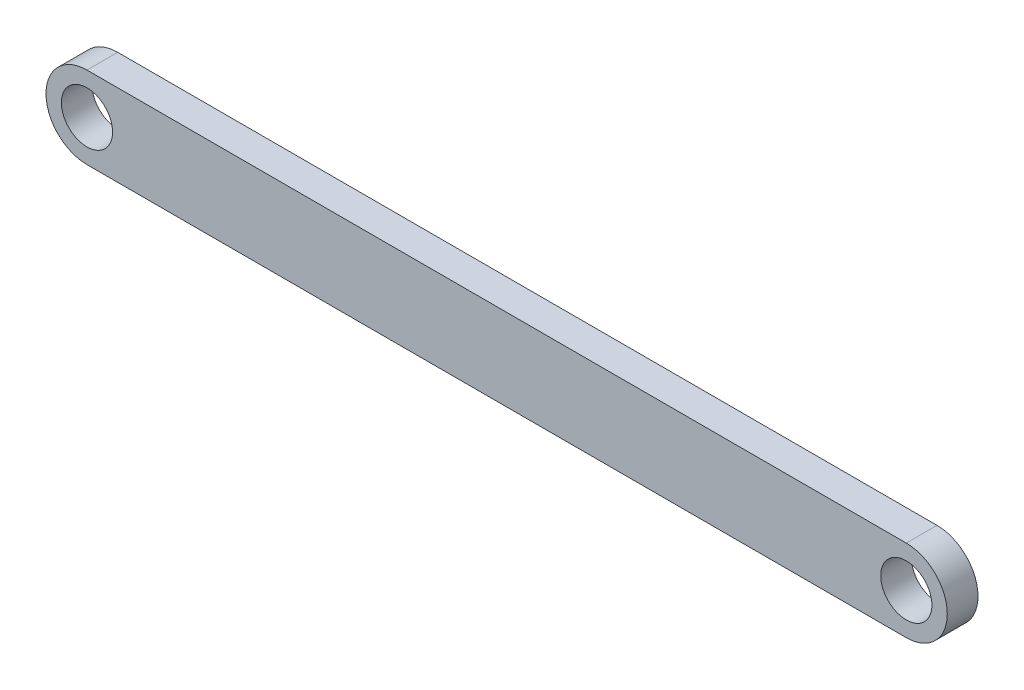
ISO-10303-21;
HEADER;
FILE_DESCRIPTION(('STEP AP214'),'2;1');
FILE_NAME('part.step','',(''),(''),'','','');
FILE_SCHEMA(('AUTOMOTIVE_DESIGN { 1 0 10303 214 1 1 1 1 }'));
ENDSEC;
DATA;
#1=APPLICATION_CONTEXT('core data for automotive mechanical design processes');
#2=APPLICATION_PROTOCOL_DEFINITION('international standard','automotive_design',2000,#1);
#3=PRODUCT_CONTEXT('',#1,'mechanical');
#4=PRODUCT('Part','Part','',(#3));
#5=PRODUCT_RELATED_PRODUCT_CATEGORY('part','',(#4));
#6=PRODUCT_DEFINITION_FORMATION('','',#4);
#7=PRODUCT_DEFINITION_CONTEXT('part definition',#1,'design');
#8=PRODUCT_DEFINITION('design','',#6,#7);
#9=PRODUCT_DEFINITION_SHAPE('','',#8);
#10=(LENGTH_UNIT() NAMED_UNIT(*) SI_UNIT(.MILLI.,.METRE.));
#11=(NAMED_UNIT(*) PLANE_ANGLE_UNIT() SI_UNIT($,.RADIAN.));
#12=(NAMED_UNIT(*) SI_UNIT($,.STERADIAN.) SOLID_ANGLE_UNIT());
#13=UNCERTAINTY_MEASURE_WITH_UNIT(LENGTH_MEASURE(1.E-05),#10,'distance_accuracy_value','');
#14=(GEOMETRIC_REPRESENTATION_CONTEXT(3) GLOBAL_UNCERTAINTY_ASSIGNED_CONTEXT((#13)) GLOBAL_UNIT_ASSIGNED_CONTEXT((#10,
#11,#12)) REPRESENTATION_CONTEXT('',''));
#15=CARTESIAN_POINT('',(0.,0.,0.));
#16=DIRECTION('',(0.,0.,1.));
#17=DIRECTION('',(1.,0.,0.));
#18=AXIS2_PLACEMENT_3D('',#15,#16,#17);
#19=CARTESIAN_POINT('',(-40.,4.00000000000001,3.));
#20=DIRECTION('',(0.,1.,0.));
#21=DIRECTION('',(-1.,0.,0.));
#22=AXIS2_PLACEMENT_3D('',#19,#20,#21);
#23=PLANE('',#22);
#24=DIRECTION('',(1.,0.,0.));
#25=VECTOR('',#24,1.);
#26=CARTESIAN_POINT('',(-40.,4.00000000000001,0.));
#27=LINE('',#26,#25);
#28=CARTESIAN_POINT('',(-40.,4.00000000000001,0.));
#29=VERTEX_POINT('',#28);
#30=CARTESIAN_POINT('',(40.,4.,0.));
#31=VERTEX_POINT('',#30);
#32=EDGE_CURVE('E136',#29,#31,#27,.T.);
#33=ORIENTED_EDGE('',*,*,#32,.F.);
#34=DIRECTION('',(0.,0.,-1.));
#35=VECTOR('',#34,1.);
#36=CARTESIAN_POINT('',(-40.,4.00000000000001,3.));
#37=LINE('',#36,#35);
#38=CARTESIAN_POINT('',(-40.,4.00000000000001,3.));
#39=VERTEX_POINT('',#38);
#40=EDGE_CURVE('E12',#39,#29,#37,.T.);
#41=ORIENTED_EDGE('',*,*,#40,.F.);
#42=DIRECTION('',(1.,0.,0.));
#43=VECTOR('',#42,1.);
#44=CARTESIAN_POINT('',(-40.,4.00000000000001,3.));
#45=LINE('',#44,#43);
#46=CARTESIAN_POINT('',(40.,4.,3.));
#47=VERTEX_POINT('',#46);
#48=EDGE_CURVE('E130',#39,#47,#45,.T.);
#49=ORIENTED_EDGE('',*,*,#48,.T.);
#50=DIRECTION('',(0.,0.,-1.));
#51=VECTOR('',#50,1.);
#52=CARTESIAN_POINT('',(40.,4.,3.));
#53=LINE('',#52,#51);
#54=EDGE_CURVE('E112',#47,#31,#53,.T.);
#55=ORIENTED_EDGE('',*,*,#54,.T.);
#56=EDGE_LOOP('',(#33,#41,#49,#55));
#57=FACE_BOUND('',#56,.T.);
#58=ADVANCED_FACE('F69',(#57),#23,.T.);
#59=CARTESIAN_POINT('',(-40.,-4.00000000000003,3.));
#60=DIRECTION('',(0.,1.,0.));
#61=DIRECTION('',(-1.,0.,0.));
#62=AXIS2_PLACEMENT_3D('',#59,#60,#61);
#63=PLANE('',#62);
#64=DIRECTION('',(1.,0.,0.));
#65=VECTOR('',#64,1.);
#66=CARTESIAN_POINT('',(-40.,-4.00000000000003,0.));
#67=LINE('',#66,#65);
#68=CARTESIAN_POINT('',(-40.,-4.00000000000003,0.));
#69=VERTEX_POINT('',#68);
#70=CARTESIAN_POINT('',(40.,-4.,0.));
#71=VERTEX_POINT('',#70);
#72=EDGE_CURVE('E120',#69,#71,#67,.T.);
#73=ORIENTED_EDGE('',*,*,#72,.T.);
#74=DIRECTION('',(0.,0.,-1.));
#75=VECTOR('',#74,1.);
#76=CARTESIAN_POINT('',(40.,-4.,3.));
#77=LINE('',#76,#75);
#78=CARTESIAN_POINT('',(40.,-4.,3.));
#79=VERTEX_POINT('',#78);
#80=EDGE_CURVE('E115',#79,#71,#77,.T.);
#81=ORIENTED_EDGE('',*,*,#80,.F.);
#82=DIRECTION('',(1.,0.,0.));
#83=VECTOR('',#82,1.);
#84=CARTESIAN_POINT('',(-40.,-4.00000000000003,3.));
#85=LINE('',#84,#83);
#86=CARTESIAN_POINT('',(-40.,-4.00000000000003,3.));
#87=VERTEX_POINT('',#86);
#88=EDGE_CURVE('E118',#87,#79,#85,.T.);
#89=ORIENTED_EDGE('',*,*,#88,.F.);
#90=DIRECTION('',(0.,0.,-1.));
#91=VECTOR('',#90,1.);
#92=CARTESIAN_POINT('',(-40.,-4.00000000000003,3.));
#93=LINE('',#92,#91);
#94=EDGE_CURVE('E79',#87,#69,#93,.T.);
#95=ORIENTED_EDGE('',*,*,#94,.T.);
#96=EDGE_LOOP('',(#73,#81,#89,#95));
#97=FACE_BOUND('',#96,.T.);
#98=ADVANCED_FACE('F116',(#97),#63,.F.);
#99=CARTESIAN_POINT('',(0.,0.,0.));
#100=DIRECTION('',(0.,0.,1.));
#101=DIRECTION('',(1.,0.,0.));
#102=AXIS2_PLACEMENT_3D('',#99,#100,#101);
#103=PLANE('',#102);
#104=CARTESIAN_POINT('',(-40.,0.,0.));
#105=DIRECTION('',(0.,0.,1.));
#106=DIRECTION('',(1.,0.,0.));
#107=AXIS2_PLACEMENT_3D('',#104,#105,#106);
#108=CIRCLE('',#107,2.49999999999999);
#109=CARTESIAN_POINT('',(-37.5,0.,0.));
#110=VERTEX_POINT('',#109);
#111=EDGE_CURVE('E145',#110,#110,#108,.F.);
#112=ORIENTED_EDGE('',*,*,#111,.F.);
#113=EDGE_LOOP('',(#112));
#114=FACE_BOUND('',#113,.T.);
#115=CARTESIAN_POINT('',(40.,0.,0.));
#116=DIRECTION('',(0.,0.,1.));
#117=DIRECTION('',(1.,0.,0.));
#118=AXIS2_PLACEMENT_3D('',#115,#116,#117);
#119=CIRCLE('',#118,2.5);
#120=CARTESIAN_POINT('',(42.5,0.,0.));
#121=VERTEX_POINT('',#120);
#122=EDGE_CURVE('E155',#121,#121,#119,.F.);
#123=ORIENTED_EDGE('',*,*,#122,.F.);
#124=EDGE_LOOP('',(#123));
#125=FACE_BOUND('',#124,.T.);
#126=ORIENTED_EDGE('',*,*,#72,.F.);
#127=CARTESIAN_POINT('',(-40.,0.,0.));
#128=DIRECTION('',(0.,0.,1.));
#129=DIRECTION('',(1.,0.,0.));
#130=AXIS2_PLACEMENT_3D('',#127,#128,#129);
#131=CIRCLE('',#130,4.);
#132=EDGE_CURVE('E126',#29,#69,#131,.T.);
#133=ORIENTED_EDGE('',*,*,#132,.F.);
#134=ORIENTED_EDGE('',*,*,#32,.T.);
#135=CARTESIAN_POINT('',(40.,0.,0.));
#136=DIRECTION('',(0.,0.,1.));
#137=DIRECTION('',(1.,0.,0.));
#138=AXIS2_PLACEMENT_3D('',#135,#136,#137);
#139=CIRCLE('',#138,4.);
#140=EDGE_CURVE('E73',#71,#31,#139,.T.);
#141=ORIENTED_EDGE('',*,*,#140,.F.);
#142=EDGE_LOOP('',(#126,#133,#134,#141));
#143=FACE_BOUND('',#142,.T.);
#144=ADVANCED_FACE('F144',(#114,#125,#143),#103,.F.);
#145=CARTESIAN_POINT('',(0.,0.,3.));
#146=DIRECTION('',(0.,0.,1.));
#147=DIRECTION('',(1.,0.,0.));
#148=AXIS2_PLACEMENT_3D('',#145,#146,#147);
#149=PLANE('',#148);
#150=CARTESIAN_POINT('',(-40.,0.,3.));
#151=DIRECTION('',(0.,0.,1.));
#152=DIRECTION('',(1.,0.,0.));
#153=AXIS2_PLACEMENT_3D('',#150,#151,#152);
#154=CIRCLE('',#153,2.49999999999999);
#155=CARTESIAN_POINT('',(-37.5,0.,3.));
#156=VERTEX_POINT('',#155);
#157=EDGE_CURVE('E147',#156,#156,#154,.T.);
#158=ORIENTED_EDGE('',*,*,#157,.F.);
#159=EDGE_LOOP('',(#158));
#160=FACE_BOUND('',#159,.T.);
#161=CARTESIAN_POINT('',(40.,0.,3.));
#162=DIRECTION('',(0.,0.,1.));
#163=DIRECTION('',(1.,0.,0.));
#164=AXIS2_PLACEMENT_3D('',#161,#162,#163);
#165=CIRCLE('',#164,2.5);
#166=CARTESIAN_POINT('',(42.5,0.,3.));
#167=VERTEX_POINT('',#166);
#168=EDGE_CURVE('E152',#167,#167,#165,.T.);
#169=ORIENTED_EDGE('',*,*,#168,.F.);
#170=EDGE_LOOP('',(#169));
#171=FACE_BOUND('',#170,.T.);
#172=ORIENTED_EDGE('',*,*,#48,.F.);
#173=CARTESIAN_POINT('',(-40.,0.,3.));
#174=DIRECTION('',(0.,0.,1.));
#175=DIRECTION('',(1.,0.,0.));
#176=AXIS2_PLACEMENT_3D('',#173,#174,#175);
#177=CIRCLE('',#176,4.);
#178=EDGE_CURVE('E129',#39,#87,#177,.T.);
#179=ORIENTED_EDGE('',*,*,#178,.T.);
#180=ORIENTED_EDGE('',*,*,#88,.T.);
#181=CARTESIAN_POINT('',(40.,0.,3.));
#182=DIRECTION('',(0.,0.,1.));
#183=DIRECTION('',(1.,0.,0.));
#184=AXIS2_PLACEMENT_3D('',#181,#182,#183);
#185=CIRCLE('',#184,4.);
#186=EDGE_CURVE('E123',#79,#47,#185,.T.);
#187=ORIENTED_EDGE('',*,*,#186,.T.);
#188=EDGE_LOOP('',(#172,#179,#180,#187));
#189=FACE_BOUND('',#188,.T.);
#190=ADVANCED_FACE('F128',(#160,#171,#189),#149,.T.);
#191=CARTESIAN_POINT('',(40.,0.,3.));
#192=DIRECTION('',(0.,0.,-1.));
#193=DIRECTION('',(-1.,0.,0.));
#194=AXIS2_PLACEMENT_3D('',#191,#192,#193);
#195=CYLINDRICAL_SURFACE('',#194,4.);
#196=ORIENTED_EDGE('',*,*,#140,.T.);
#197=ORIENTED_EDGE('',*,*,#54,.F.);
#198=ORIENTED_EDGE('',*,*,#186,.F.);
#199=ORIENTED_EDGE('',*,*,#80,.T.);
#200=EDGE_LOOP('',(#196,#197,#198,#199));
#201=FACE_BOUND('',#200,.T.);
#202=ADVANCED_FACE('F71',(#201),#195,.T.);
#203=CARTESIAN_POINT('',(-40.,0.,3.));
#204=DIRECTION('',(0.,0.,-1.));
#205=DIRECTION('',(-1.,0.,0.));
#206=AXIS2_PLACEMENT_3D('',#203,#204,#205);
#207=CYLINDRICAL_SURFACE('',#206,4.);
#208=ORIENTED_EDGE('',*,*,#40,.T.);
#209=ORIENTED_EDGE('',*,*,#132,.T.);
#210=ORIENTED_EDGE('',*,*,#94,.F.);
#211=ORIENTED_EDGE('',*,*,#178,.F.);
#212=EDGE_LOOP('',(#208,#209,#210,#211));
#213=FACE_BOUND('',#212,.T.);
#214=ADVANCED_FACE('F142',(#213),#207,.T.);
#215=CARTESIAN_POINT('',(40.,0.,-7.07106781186548));
#216=DIRECTION('',(0.,0.,1.));
#217=DIRECTION('',(1.,0.,0.));
#218=AXIS2_PLACEMENT_3D('',#215,#216,#217);
#219=CYLINDRICAL_SURFACE('',#218,2.5);
#220=ORIENTED_EDGE('',*,*,#122,.T.);
#221=EDGE_LOOP('',(#220));
#222=FACE_BOUND('',#221,.T.);
#223=ORIENTED_EDGE('',*,*,#168,.T.);
#224=EDGE_LOOP('',(#223));
#225=FACE_BOUND('',#224,.T.);
#226=ADVANCED_FACE('F160',(#222,#225),#219,.F.);
#227=CARTESIAN_POINT('',(-40.,0.,-7.07106781186548));
#228=DIRECTION('',(0.,0.,1.));
#229=DIRECTION('',(1.,0.,0.));
#230=AXIS2_PLACEMENT_3D('',#227,#228,#229);
#231=CYLINDRICAL_SURFACE('',#230,2.49999999999999);
#232=ORIENTED_EDGE('',*,*,#111,.T.);
#233=EDGE_LOOP('',(#232));
#234=FACE_BOUND('',#233,.T.);
#235=ORIENTED_EDGE('',*,*,#157,.T.);
#236=EDGE_LOOP('',(#235));
#237=FACE_BOUND('',#236,.T.);
#238=ADVANCED_FACE('F183',(#234,#237),#231,.F.);
#239=CLOSED_SHELL('',(#58,#98,#144,#190,#202,#214,#226,#238));
#240=MANIFOLD_SOLID_BREP('B2',#239);
#241=ADVANCED_BREP_SHAPE_REPRESENTATION('',(#18,#240),#14);
#242=SHAPE_DEFINITION_REPRESENTATION(#9,#241);
ENDSEC;
END-ISO-10303-21;
